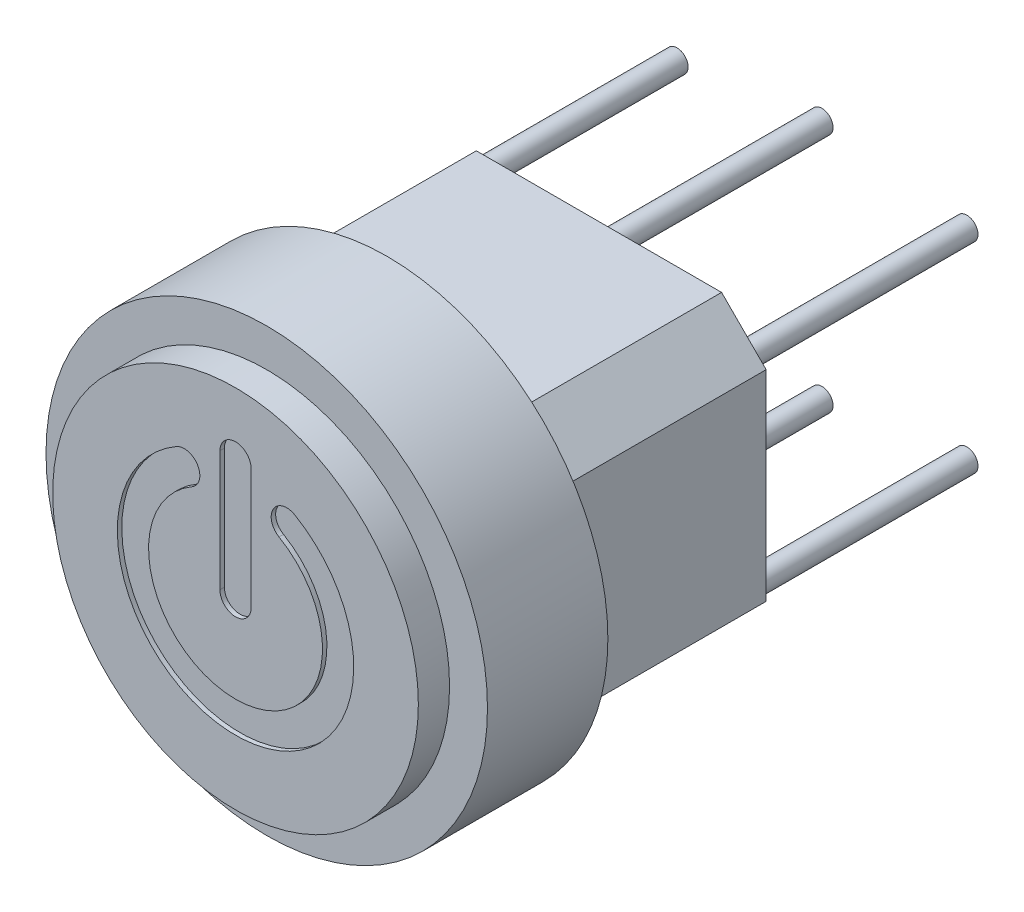
ISO-10303-21;
HEADER;
FILE_DESCRIPTION(('STEP AP214'),'2;1');
FILE_NAME('part.step','',(''),(''),'','','');
FILE_SCHEMA(('AUTOMOTIVE_DESIGN { 1 0 10303 214 1 1 1 1 }'));
ENDSEC;
DATA;
#1=APPLICATION_CONTEXT('core data for automotive mechanical design processes');
#2=APPLICATION_PROTOCOL_DEFINITION('international standard','automotive_design',2000,#1);
#3=PRODUCT_CONTEXT('',#1,'mechanical');
#4=PRODUCT('Part','Part','',(#3));
#5=PRODUCT_RELATED_PRODUCT_CATEGORY('part','',(#4));
#6=PRODUCT_DEFINITION_FORMATION('','',#4);
#7=PRODUCT_DEFINITION_CONTEXT('part definition',#1,'design');
#8=PRODUCT_DEFINITION('design','',#6,#7);
#9=PRODUCT_DEFINITION_SHAPE('','',#8);
#10=(LENGTH_UNIT() NAMED_UNIT(*) SI_UNIT(.MILLI.,.METRE.));
#11=(NAMED_UNIT(*) PLANE_ANGLE_UNIT() SI_UNIT($,.RADIAN.));
#12=(NAMED_UNIT(*) SI_UNIT($,.STERADIAN.) SOLID_ANGLE_UNIT());
#13=UNCERTAINTY_MEASURE_WITH_UNIT(LENGTH_MEASURE(1.E-05),#10,'distance_accuracy_value','');
#14=(GEOMETRIC_REPRESENTATION_CONTEXT(3) GLOBAL_UNCERTAINTY_ASSIGNED_CONTEXT((#13)) GLOBAL_UNIT_ASSIGNED_CONTEXT((#10,
#11,#12)) REPRESENTATION_CONTEXT('',''));
#15=CARTESIAN_POINT('',(0.,0.,0.));
#16=DIRECTION('',(0.,0.,1.));
#17=DIRECTION('',(1.,0.,0.));
#18=AXIS2_PLACEMENT_3D('',#15,#16,#17);
#19=CARTESIAN_POINT('',(0.,0.,0.));
#20=DIRECTION('',(0.,0.,1.));
#21=DIRECTION('',(1.,0.,0.));
#22=AXIS2_PLACEMENT_3D('',#19,#20,#21);
#23=PLANE('',#22);
#24=CARTESIAN_POINT('',(0.,0.,0.));
#25=DIRECTION('',(0.,0.,1.));
#26=DIRECTION('',(1.,0.,0.));
#27=AXIS2_PLACEMENT_3D('',#24,#25,#26);
#28=CIRCLE('',#27,4.95);
#29=CARTESIAN_POINT('',(-4.95,0.,0.));
#30=VERTEX_POINT('',#29);
#31=EDGE_CURVE('E290',#30,#30,#28,.T.);
#32=ORIENTED_EDGE('',*,*,#31,.F.);
#33=EDGE_LOOP('',(#32));
#34=FACE_BOUND('',#33,.T.);
#35=DIRECTION('',(1.,0.,0.));
#36=VECTOR('',#35,1.);
#37=CARTESIAN_POINT('',(3.75,3.25,0.));
#38=LINE('',#37,#36);
#39=CARTESIAN_POINT('',(-2.75,3.25,0.));
#40=VERTEX_POINT('',#39);
#41=CARTESIAN_POINT('',(2.75,3.25,0.));
#42=VERTEX_POINT('',#41);
#43=EDGE_CURVE('E294',#40,#42,#38,.T.);
#44=ORIENTED_EDGE('',*,*,#43,.F.);
#45=DIRECTION('',(0.707106781186546,0.707106781186549,0.));
#46=VECTOR('',#45,1.);
#47=CARTESIAN_POINT('',(-3.,2.99999999999999,0.));
#48=LINE('',#47,#46);
#49=CARTESIAN_POINT('',(-3.75,2.25,0.));
#50=VERTEX_POINT('',#49);
#51=EDGE_CURVE('E334',#40,#50,#48,.F.);
#52=ORIENTED_EDGE('',*,*,#51,.T.);
#53=DIRECTION('',(0.,1.,0.));
#54=VECTOR('',#53,1.);
#55=CARTESIAN_POINT('',(-3.75,3.25,0.));
#56=LINE('',#55,#54);
#57=CARTESIAN_POINT('',(-3.75,-2.25,0.));
#58=VERTEX_POINT('',#57);
#59=EDGE_CURVE('E278',#58,#50,#56,.T.);
#60=ORIENTED_EDGE('',*,*,#59,.F.);
#61=DIRECTION('',(-0.707106781186549,0.707106781186546,0.));
#62=VECTOR('',#61,1.);
#63=CARTESIAN_POINT('',(-3.,-3.,0.));
#64=LINE('',#63,#62);
#65=CARTESIAN_POINT('',(-2.75,-3.25,0.));
#66=VERTEX_POINT('',#65);
#67=EDGE_CURVE('E336',#58,#66,#64,.F.);
#68=ORIENTED_EDGE('',*,*,#67,.T.);
#69=DIRECTION('',(-1.,0.,0.));
#70=VECTOR('',#69,1.);
#71=CARTESIAN_POINT('',(3.75,-3.25,0.));
#72=LINE('',#71,#70);
#73=CARTESIAN_POINT('',(2.75,-3.25,0.));
#74=VERTEX_POINT('',#73);
#75=EDGE_CURVE('E293',#74,#66,#72,.T.);
#76=ORIENTED_EDGE('',*,*,#75,.F.);
#77=DIRECTION('',(-0.707106781186546,-0.707106781186549,0.));
#78=VECTOR('',#77,1.);
#79=CARTESIAN_POINT('',(3.00000000000001,-2.99999999999999,0.));
#80=LINE('',#79,#78);
#81=CARTESIAN_POINT('',(3.75,-2.24999999999999,0.));
#82=VERTEX_POINT('',#81);
#83=EDGE_CURVE('E64',#74,#82,#80,.F.);
#84=ORIENTED_EDGE('',*,*,#83,.T.);
#85=DIRECTION('',(0.,-1.,0.));
#86=VECTOR('',#85,1.);
#87=CARTESIAN_POINT('',(3.75,3.25,0.));
#88=LINE('',#87,#86);
#89=CARTESIAN_POINT('',(3.75,2.25,0.));
#90=VERTEX_POINT('',#89);
#91=EDGE_CURVE('E297',#90,#82,#88,.T.);
#92=ORIENTED_EDGE('',*,*,#91,.F.);
#93=DIRECTION('',(0.707106781186549,-0.707106781186546,0.));
#94=VECTOR('',#93,1.);
#95=CARTESIAN_POINT('',(2.99999999999999,3.00000000000001,0.));
#96=LINE('',#95,#94);
#97=EDGE_CURVE('E12',#90,#42,#96,.F.);
#98=ORIENTED_EDGE('',*,*,#97,.T.);
#99=EDGE_LOOP('',(#44,#52,#60,#68,#76,#84,#92,#98));
#100=FACE_BOUND('',#99,.T.);
#101=ADVANCED_FACE('F56',(#34,#100),#23,.F.);
#102=CARTESIAN_POINT('',(0.,0.,2.7));
#103=DIRECTION('',(0.,0.,-1.));
#104=DIRECTION('',(-1.,0.,0.));
#105=AXIS2_PLACEMENT_3D('',#102,#103,#104);
#106=CYLINDRICAL_SURFACE('',#105,4.95);
#107=CARTESIAN_POINT('',(0.,0.,2.7));
#108=DIRECTION('',(0.,0.,1.));
#109=DIRECTION('',(1.,0.,0.));
#110=AXIS2_PLACEMENT_3D('',#107,#108,#109);
#111=CIRCLE('',#110,4.95);
#112=CARTESIAN_POINT('',(-4.95,0.,2.7));
#113=VERTEX_POINT('',#112);
#114=EDGE_CURVE('E298',#113,#113,#111,.T.);
#115=CARTESIAN_POINT('',(-4.95,0.,2.7));
#116=CARTESIAN_POINT('',(-4.95,0.,2.671875));
#117=CARTESIAN_POINT('',(-4.95,0.,2.64375));
#118=CARTESIAN_POINT('',(-4.95,0.,2.5875));
#119=CARTESIAN_POINT('',(-4.95,0.,2.559375));
#120=CARTESIAN_POINT('',(-4.95,0.,2.503125));
#121=CARTESIAN_POINT('',(-4.95,0.,2.475));
#122=CARTESIAN_POINT('',(-4.95,0.,2.41875));
#123=CARTESIAN_POINT('',(-4.95,0.,2.390625));
#124=CARTESIAN_POINT('',(-4.95,0.,2.334375));
#125=CARTESIAN_POINT('',(-4.95,0.,2.30625));
#126=CARTESIAN_POINT('',(-4.95,0.,2.25));
#127=CARTESIAN_POINT('',(-4.95,0.,2.221875));
#128=CARTESIAN_POINT('',(-4.95,0.,2.165625));
#129=CARTESIAN_POINT('',(-4.95,0.,2.1375));
#130=CARTESIAN_POINT('',(-4.95,0.,2.08125));
#131=CARTESIAN_POINT('',(-4.95,0.,2.053125));
#132=CARTESIAN_POINT('',(-4.95,0.,1.996875));
#133=CARTESIAN_POINT('',(-4.95,0.,1.96875));
#134=CARTESIAN_POINT('',(-4.95,0.,1.9125));
#135=CARTESIAN_POINT('',(-4.95,0.,1.884375));
#136=CARTESIAN_POINT('',(-4.95,0.,1.828125));
#137=CARTESIAN_POINT('',(-4.95,0.,1.8));
#138=CARTESIAN_POINT('',(-4.95,0.,1.74375));
#139=CARTESIAN_POINT('',(-4.95,0.,1.715625));
#140=CARTESIAN_POINT('',(-4.95,0.,1.659375));
#141=CARTESIAN_POINT('',(-4.95,0.,1.63125));
#142=CARTESIAN_POINT('',(-4.95,0.,1.575));
#143=CARTESIAN_POINT('',(-4.95,0.,1.546875));
#144=CARTESIAN_POINT('',(-4.95,0.,1.490625));
#145=CARTESIAN_POINT('',(-4.95,0.,1.4625));
#146=CARTESIAN_POINT('',(-4.95,0.,1.40625));
#147=CARTESIAN_POINT('',(-4.95,0.,1.378125));
#148=CARTESIAN_POINT('',(-4.95,0.,1.321875));
#149=CARTESIAN_POINT('',(-4.95,0.,1.29375));
#150=CARTESIAN_POINT('',(-4.95,0.,1.2375));
#151=CARTESIAN_POINT('',(-4.95,0.,1.209375));
#152=CARTESIAN_POINT('',(-4.95,0.,1.153125));
#153=CARTESIAN_POINT('',(-4.95,0.,1.125));
#154=CARTESIAN_POINT('',(-4.95,0.,1.06875));
#155=CARTESIAN_POINT('',(-4.95,0.,1.040625));
#156=CARTESIAN_POINT('',(-4.95,0.,0.984375));
#157=CARTESIAN_POINT('',(-4.95,0.,0.95625));
#158=CARTESIAN_POINT('',(-4.95,0.,0.9));
#159=CARTESIAN_POINT('',(-4.95,0.,0.871875));
#160=CARTESIAN_POINT('',(-4.95,0.,0.815625));
#161=CARTESIAN_POINT('',(-4.95,0.,0.7875));
#162=CARTESIAN_POINT('',(-4.95,0.,0.73125));
#163=CARTESIAN_POINT('',(-4.95,0.,0.703125));
#164=CARTESIAN_POINT('',(-4.95,0.,0.646875));
#165=CARTESIAN_POINT('',(-4.95,0.,0.61875));
#166=CARTESIAN_POINT('',(-4.95,0.,0.5625));
#167=CARTESIAN_POINT('',(-4.95,0.,0.534375));
#168=CARTESIAN_POINT('',(-4.95,0.,0.478125));
#169=CARTESIAN_POINT('',(-4.95,0.,0.45));
#170=CARTESIAN_POINT('',(-4.95,0.,0.39375));
#171=CARTESIAN_POINT('',(-4.95,0.,0.365625));
#172=CARTESIAN_POINT('',(-4.95,0.,0.309375));
#173=CARTESIAN_POINT('',(-4.95,0.,0.28125));
#174=CARTESIAN_POINT('',(-4.95,0.,0.225));
#175=CARTESIAN_POINT('',(-4.95,0.,0.196875));
#176=CARTESIAN_POINT('',(-4.95,0.,0.140625));
#177=CARTESIAN_POINT('',(-4.95,0.,0.112499999999999));
#178=CARTESIAN_POINT('',(-4.95,0.,0.0562499999999994));
#179=CARTESIAN_POINT('',(-4.95,0.,0.0281249999999995));
#180=CARTESIAN_POINT('',(-4.95,0.,0.));
#181=B_SPLINE_CURVE_WITH_KNOTS('',3,(#115,#116,#117,#118,#119,#120,#121,#122,#123,#124,#125,
#126,#127,#128,#129,#130,#131,#132,#133,#134,#135,#136,#137,#138,#139,#140,#141,#142,#143,#144,
#145,#146,#147,#148,#149,#150,#151,#152,#153,#154,#155,#156,#157,#158,#159,#160,#161,#162,#163,
#164,#165,#166,#167,#168,#169,#170,#171,#172,#173,#174,#175,#176,#177,#178,#179,#180),
.UNSPECIFIED.,.F.,.F.,(4,2,2,2,2,2,2,2,2,2,2,2,2,2,2,2,2,2,2,2,2,2,2,2,2,2,2,2,2,2,2,2,4),(0.,
0.0843749999999998,0.16875,0.253125,0.3375,0.421875,0.50625,0.590625,0.675,0.759375,0.84375,
0.928125,1.0125,1.096875,1.18125,1.265625,1.35,1.434375,1.51875,1.603125,1.6875,1.771875,
1.85625,1.940625,2.025,2.109375,2.19375,2.278125,2.3625,2.446875,2.53125,2.615625,2.7),.UNSPECIFIED.);
#182=EDGE_CURVE('BSEAM385',#113,#30,#181,.T.);
#183=ORIENTED_EDGE('',*,*,#114,.F.);
#184=ORIENTED_EDGE('',*,*,#31,.T.);
#185=ORIENTED_EDGE('',*,*,#182,.T.);
#186=ORIENTED_EDGE('',*,*,#182,.F.);
#187=EDGE_LOOP('',(#183,#185,#184,#186));
#188=FACE_BOUND('',#187,.T.);
#189=ADVANCED_FACE('F385',(#188),#106,.T.);
#190=CARTESIAN_POINT('',(0.,0.,2.7));
#191=DIRECTION('',(0.,0.,1.));
#192=DIRECTION('',(1.,0.,0.));
#193=AXIS2_PLACEMENT_3D('',#190,#191,#192);
#194=PLANE('',#193);
#195=CARTESIAN_POINT('',(0.,0.,2.7));
#196=DIRECTION('',(0.,0.,1.));
#197=DIRECTION('',(1.,0.,0.));
#198=AXIS2_PLACEMENT_3D('',#195,#196,#197);
#199=CIRCLE('',#198,4.1);
#200=CARTESIAN_POINT('',(4.1,0.,2.7));
#201=VERTEX_POINT('',#200);
#202=EDGE_CURVE('E274',#201,#201,#199,.T.);
#203=ORIENTED_EDGE('',*,*,#202,.F.);
#204=EDGE_LOOP('',(#203));
#205=FACE_BOUND('',#204,.T.);
#206=ORIENTED_EDGE('',*,*,#114,.T.);
#207=EDGE_LOOP('',(#206));
#208=FACE_BOUND('',#207,.T.);
#209=ADVANCED_FACE('F391',(#205,#208),#194,.T.);
#210=CARTESIAN_POINT('',(-3.75,3.25,-4.75));
#211=DIRECTION('',(1.,0.,0.));
#212=DIRECTION('',(0.,1.,0.));
#213=AXIS2_PLACEMENT_3D('',#210,#211,#212);
#214=PLANE('',#213);
#215=ORIENTED_EDGE('',*,*,#59,.T.);
#216=DIRECTION('',(0.,0.,-1.));
#217=VECTOR('',#216,1.);
#218=CARTESIAN_POINT('',(-3.75,2.25,-4.75));
#219=LINE('',#218,#217);
#220=CARTESIAN_POINT('',(-3.75,2.25,-4.75));
#221=VERTEX_POINT('',#220);
#222=EDGE_CURVE('E314',#50,#221,#219,.T.);
#223=ORIENTED_EDGE('',*,*,#222,.T.);
#224=DIRECTION('',(0.,1.,0.));
#225=VECTOR('',#224,1.);
#226=CARTESIAN_POINT('',(-3.75,3.25,-4.75));
#227=LINE('',#226,#225);
#228=CARTESIAN_POINT('',(-3.75,-2.25,-4.75));
#229=VERTEX_POINT('',#228);
#230=EDGE_CURVE('E273',#229,#221,#227,.T.);
#231=ORIENTED_EDGE('',*,*,#230,.F.);
#232=DIRECTION('',(0.,0.,1.));
#233=VECTOR('',#232,1.);
#234=CARTESIAN_POINT('',(-3.75,-2.25,-4.75));
#235=LINE('',#234,#233);
#236=EDGE_CURVE('E311',#229,#58,#235,.T.);
#237=ORIENTED_EDGE('',*,*,#236,.T.);
#238=EDGE_LOOP('',(#215,#223,#231,#237));
#239=FACE_BOUND('',#238,.T.);
#240=ADVANCED_FACE('F363',(#239),#214,.F.);
#241=CARTESIAN_POINT('',(3.75,3.25,-4.75));
#242=DIRECTION('',(0.,-1.,0.));
#243=DIRECTION('',(0.,0.,-1.));
#244=AXIS2_PLACEMENT_3D('',#241,#242,#243);
#245=PLANE('',#244);
#246=DIRECTION('',(1.,0.,0.));
#247=VECTOR('',#246,1.);
#248=CARTESIAN_POINT('',(3.75,3.25,-4.75));
#249=LINE('',#248,#247);
#250=CARTESIAN_POINT('',(-2.75,3.25,-4.75));
#251=VERTEX_POINT('',#250);
#252=CARTESIAN_POINT('',(2.75,3.25,-4.75));
#253=VERTEX_POINT('',#252);
#254=EDGE_CURVE('E281',#251,#253,#249,.T.);
#255=ORIENTED_EDGE('',*,*,#254,.F.);
#256=DIRECTION('',(0.,0.,1.));
#257=VECTOR('',#256,1.);
#258=CARTESIAN_POINT('',(-2.75,3.25,-4.75));
#259=LINE('',#258,#257);
#260=EDGE_CURVE('E308',#251,#40,#259,.T.);
#261=ORIENTED_EDGE('',*,*,#260,.T.);
#262=ORIENTED_EDGE('',*,*,#43,.T.);
#263=DIRECTION('',(0.,0.,-1.));
#264=VECTOR('',#263,1.);
#265=CARTESIAN_POINT('',(2.75,3.25,-4.75));
#266=LINE('',#265,#264);
#267=EDGE_CURVE('E277',#42,#253,#266,.T.);
#268=ORIENTED_EDGE('',*,*,#267,.T.);
#269=EDGE_LOOP('',(#255,#261,#262,#268));
#270=FACE_BOUND('',#269,.T.);
#271=ADVANCED_FACE('F372',(#270),#245,.F.);
#272=CARTESIAN_POINT('',(3.75,3.25,-4.75));
#273=DIRECTION('',(-1.,0.,0.));
#274=DIRECTION('',(0.,-1.,0.));
#275=AXIS2_PLACEMENT_3D('',#272,#273,#274);
#276=PLANE('',#275);
#277=ORIENTED_EDGE('',*,*,#91,.T.);
#278=DIRECTION('',(0.,0.,-1.));
#279=VECTOR('',#278,1.);
#280=CARTESIAN_POINT('',(3.75,-2.25,-4.75));
#281=LINE('',#280,#279);
#282=CARTESIAN_POINT('',(3.75,-2.24999999999999,-4.75));
#283=VERTEX_POINT('',#282);
#284=EDGE_CURVE('E332',#82,#283,#281,.T.);
#285=ORIENTED_EDGE('',*,*,#284,.T.);
#286=DIRECTION('',(0.,-1.,0.));
#287=VECTOR('',#286,1.);
#288=CARTESIAN_POINT('',(3.75,3.25,-4.75));
#289=LINE('',#288,#287);
#290=CARTESIAN_POINT('',(3.75,2.25,-4.75));
#291=VERTEX_POINT('',#290);
#292=EDGE_CURVE('E284',#291,#283,#289,.T.);
#293=ORIENTED_EDGE('',*,*,#292,.F.);
#294=DIRECTION('',(0.,0.,1.));
#295=VECTOR('',#294,1.);
#296=CARTESIAN_POINT('',(3.75,2.25,-4.75));
#297=LINE('',#296,#295);
#298=EDGE_CURVE('E329',#291,#90,#297,.T.);
#299=ORIENTED_EDGE('',*,*,#298,.T.);
#300=EDGE_LOOP('',(#277,#285,#293,#299));
#301=FACE_BOUND('',#300,.T.);
#302=ADVANCED_FACE('F345',(#301),#276,.F.);
#303=CARTESIAN_POINT('',(3.75,-3.25,-4.75));
#304=DIRECTION('',(0.,1.,0.));
#305=DIRECTION('',(0.,0.,1.));
#306=AXIS2_PLACEMENT_3D('',#303,#304,#305);
#307=PLANE('',#306);
#308=ORIENTED_EDGE('',*,*,#75,.T.);
#309=DIRECTION('',(0.,0.,-1.));
#310=VECTOR('',#309,1.);
#311=CARTESIAN_POINT('',(-2.75,-3.25,-4.75));
#312=LINE('',#311,#310);
#313=CARTESIAN_POINT('',(-2.75,-3.25,-4.75));
#314=VERTEX_POINT('',#313);
#315=EDGE_CURVE('E327',#66,#314,#312,.T.);
#316=ORIENTED_EDGE('',*,*,#315,.T.);
#317=DIRECTION('',(-1.,0.,0.));
#318=VECTOR('',#317,1.);
#319=CARTESIAN_POINT('',(3.75,-3.25,-4.75));
#320=LINE('',#319,#318);
#321=CARTESIAN_POINT('',(2.75,-3.25,-4.75));
#322=VERTEX_POINT('',#321);
#323=EDGE_CURVE('E287',#322,#314,#320,.T.);
#324=ORIENTED_EDGE('',*,*,#323,.F.);
#325=DIRECTION('',(0.,0.,1.));
#326=VECTOR('',#325,1.);
#327=CARTESIAN_POINT('',(2.75,-3.25,-4.75));
#328=LINE('',#327,#326);
#329=EDGE_CURVE('E324',#322,#74,#328,.T.);
#330=ORIENTED_EDGE('',*,*,#329,.T.);
#331=EDGE_LOOP('',(#308,#316,#324,#330));
#332=FACE_BOUND('',#331,.T.);
#333=ADVANCED_FACE('F355',(#332),#307,.F.);
#334=CARTESIAN_POINT('',(0.,0.,-4.75));
#335=DIRECTION('',(0.,0.,-1.));
#336=DIRECTION('',(-1.,0.,0.));
#337=AXIS2_PLACEMENT_3D('',#334,#335,#336);
#338=PLANE('',#337);
#339=CARTESIAN_POINT('',(3.25,-2.25,-4.75));
#340=DIRECTION('',(0.,0.,-1.));
#341=DIRECTION('',(1.,0.,0.));
#342=AXIS2_PLACEMENT_3D('',#339,#340,#341);
#343=CIRCLE('',#342,0.25);
#344=CARTESIAN_POINT('',(3.5,-2.25,-4.75));
#345=VERTEX_POINT('',#344);
#346=EDGE_CURVE('E229',#345,#345,#343,.T.);
#347=ORIENTED_EDGE('',*,*,#346,.F.);
#348=EDGE_LOOP('',(#347));
#349=FACE_BOUND('',#348,.T.);
#350=CARTESIAN_POINT('',(0.,-2.7,-4.75));
#351=DIRECTION('',(0.,0.,-1.));
#352=DIRECTION('',(1.,0.,0.));
#353=AXIS2_PLACEMENT_3D('',#350,#351,#352);
#354=CIRCLE('',#353,0.25);
#355=CARTESIAN_POINT('',(0.250000000000006,-2.7,-4.75));
#356=VERTEX_POINT('',#355);
#357=EDGE_CURVE('E238',#356,#356,#354,.T.);
#358=ORIENTED_EDGE('',*,*,#357,.F.);
#359=EDGE_LOOP('',(#358));
#360=FACE_BOUND('',#359,.T.);
#361=CARTESIAN_POINT('',(-3.24999999999999,-2.25000000000001,-4.75));
#362=DIRECTION('',(0.,0.,-1.));
#363=DIRECTION('',(1.,0.,0.));
#364=AXIS2_PLACEMENT_3D('',#361,#362,#363);
#365=CIRCLE('',#364,0.25);
#366=CARTESIAN_POINT('',(-2.99999999999999,-2.25000000000001,-4.75));
#367=VERTEX_POINT('',#366);
#368=EDGE_CURVE('E244',#367,#367,#365,.T.);
#369=ORIENTED_EDGE('',*,*,#368,.F.);
#370=EDGE_LOOP('',(#369));
#371=FACE_BOUND('',#370,.T.);
#372=CARTESIAN_POINT('',(-3.25,2.25,-4.75));
#373=DIRECTION('',(0.,0.,-1.));
#374=DIRECTION('',(-1.,0.,0.));
#375=AXIS2_PLACEMENT_3D('',#372,#373,#374);
#376=CIRCLE('',#375,0.25);
#377=CARTESIAN_POINT('',(-3.5,2.25,-4.75));
#378=VERTEX_POINT('',#377);
#379=EDGE_CURVE('E250',#378,#378,#376,.T.);
#380=ORIENTED_EDGE('',*,*,#379,.F.);
#381=EDGE_LOOP('',(#380));
#382=FACE_BOUND('',#381,.T.);
#383=CARTESIAN_POINT('',(0.,2.7,-4.75));
#384=DIRECTION('',(0.,0.,-1.));
#385=DIRECTION('',(-1.,0.,0.));
#386=AXIS2_PLACEMENT_3D('',#383,#384,#385);
#387=CIRCLE('',#386,0.25);
#388=CARTESIAN_POINT('',(-0.25,2.7,-4.75));
#389=VERTEX_POINT('',#388);
#390=EDGE_CURVE('E256',#389,#389,#387,.T.);
#391=ORIENTED_EDGE('',*,*,#390,.F.);
#392=EDGE_LOOP('',(#391));
#393=FACE_BOUND('',#392,.T.);
#394=CARTESIAN_POINT('',(3.25,2.25,-4.75));
#395=DIRECTION('',(0.,0.,-1.));
#396=DIRECTION('',(-1.,0.,0.));
#397=AXIS2_PLACEMENT_3D('',#394,#395,#396);
#398=CIRCLE('',#397,0.25);
#399=CARTESIAN_POINT('',(3.,2.25,-4.75));
#400=VERTEX_POINT('',#399);
#401=EDGE_CURVE('E262',#400,#400,#398,.T.);
#402=ORIENTED_EDGE('',*,*,#401,.F.);
#403=EDGE_LOOP('',(#402));
#404=FACE_BOUND('',#403,.T.);
#405=ORIENTED_EDGE('',*,*,#230,.T.);
#406=DIRECTION('',(-0.707106781186546,-0.707106781186549,0.));
#407=VECTOR('',#406,1.);
#408=CARTESIAN_POINT('',(-3.,2.99999999999999,-4.75));
#409=LINE('',#408,#407);
#410=EDGE_CURVE('E322',#221,#251,#409,.F.);
#411=ORIENTED_EDGE('',*,*,#410,.T.);
#412=ORIENTED_EDGE('',*,*,#254,.T.);
#413=DIRECTION('',(-0.707106781186549,0.707106781186546,0.));
#414=VECTOR('',#413,1.);
#415=CARTESIAN_POINT('',(2.99999999999999,3.00000000000001,-4.75));
#416=LINE('',#415,#414);
#417=EDGE_CURVE('E316',#253,#291,#416,.F.);
#418=ORIENTED_EDGE('',*,*,#417,.T.);
#419=ORIENTED_EDGE('',*,*,#292,.T.);
#420=DIRECTION('',(0.707106781186546,0.707106781186549,0.));
#421=VECTOR('',#420,1.);
#422=CARTESIAN_POINT('',(3.00000000000001,-2.99999999999999,-4.75));
#423=LINE('',#422,#421);
#424=EDGE_CURVE('E318',#283,#322,#423,.F.);
#425=ORIENTED_EDGE('',*,*,#424,.T.);
#426=ORIENTED_EDGE('',*,*,#323,.T.);
#427=DIRECTION('',(0.707106781186549,-0.707106781186546,0.));
#428=VECTOR('',#427,1.);
#429=CARTESIAN_POINT('',(-3.,-3.,-4.75));
#430=LINE('',#429,#428);
#431=EDGE_CURVE('E320',#314,#229,#430,.F.);
#432=ORIENTED_EDGE('',*,*,#431,.T.);
#433=EDGE_LOOP('',(#405,#411,#412,#418,#419,#425,#426,#432));
#434=FACE_BOUND('',#433,.T.);
#435=ADVANCED_FACE('F352',(#349,#360,#371,#382,#393,#404,#434),#338,.T.);
#436=CARTESIAN_POINT('',(0.,0.,3.4));
#437=DIRECTION('',(0.,0.,-1.));
#438=DIRECTION('',(-1.,0.,0.));
#439=AXIS2_PLACEMENT_3D('',#436,#437,#438);
#440=CYLINDRICAL_SURFACE('',#439,4.1);
#441=CARTESIAN_POINT('',(0.,0.,3.4));
#442=DIRECTION('',(0.,0.,1.));
#443=DIRECTION('',(1.,0.,0.));
#444=AXIS2_PLACEMENT_3D('',#441,#442,#443);
#445=CIRCLE('',#444,4.1);
#446=CARTESIAN_POINT('',(4.1,0.,3.4));
#447=VERTEX_POINT('',#446);
#448=EDGE_CURVE('E268',#447,#447,#445,.T.);
#449=ORIENTED_EDGE('',*,*,#448,.F.);
#450=EDGE_LOOP('',(#449));
#451=FACE_BOUND('',#450,.T.);
#452=ORIENTED_EDGE('',*,*,#202,.T.);
#453=EDGE_LOOP('',(#452));
#454=FACE_BOUND('',#453,.T.);
#455=ADVANCED_FACE('F425',(#451,#454),#440,.T.);
#456=CARTESIAN_POINT('',(0.,0.,3.4));
#457=DIRECTION('',(0.,0.,1.));
#458=DIRECTION('',(1.,0.,0.));
#459=AXIS2_PLACEMENT_3D('',#456,#457,#458);
#460=PLANE('',#459);
#461=CARTESIAN_POINT('',(0.,0.,3.4));
#462=DIRECTION('',(0.,0.,1.));
#463=DIRECTION('',(1.,0.,0.));
#464=AXIS2_PLACEMENT_3D('',#461,#462,#463);
#465=CIRCLE('',#464,2.65);
#466=CARTESIAN_POINT('',(-1.325,2.29496732002876,3.4));
#467=VERTEX_POINT('',#466);
#468=CARTESIAN_POINT('',(1.32499999999999,2.29496732002877,3.4));
#469=VERTEX_POINT('',#468);
#470=EDGE_CURVE('E71',#467,#469,#465,.T.);
#471=ORIENTED_EDGE('',*,*,#470,.F.);
#472=CARTESIAN_POINT('',(-1.15,1.99185842870421,3.4));
#473=DIRECTION('',(0.,0.,1.));
#474=DIRECTION('',(1.,0.,0.));
#475=AXIS2_PLACEMENT_3D('',#472,#473,#474);
#476=CIRCLE('',#475,0.35);
#477=CARTESIAN_POINT('',(-0.975000000000003,1.68874953737965,3.4));
#478=VERTEX_POINT('',#477);
#479=EDGE_CURVE('E187',#467,#478,#476,.F.);
#480=ORIENTED_EDGE('',*,*,#479,.T.);
#481=CARTESIAN_POINT('',(0.,0.,3.4));
#482=DIRECTION('',(0.,0.,1.));
#483=DIRECTION('',(1.,0.,0.));
#484=AXIS2_PLACEMENT_3D('',#481,#482,#483);
#485=CIRCLE('',#484,1.95);
#486=CARTESIAN_POINT('',(0.97499999999999,1.68874953737966,3.4));
#487=VERTEX_POINT('',#486);
#488=EDGE_CURVE('E190',#478,#487,#485,.T.);
#489=ORIENTED_EDGE('',*,*,#488,.T.);
#490=CARTESIAN_POINT('',(1.14999999999999,1.99185842870422,3.4));
#491=DIRECTION('',(0.,0.,1.));
#492=DIRECTION('',(1.,0.,0.));
#493=AXIS2_PLACEMENT_3D('',#490,#491,#492);
#494=CIRCLE('',#493,0.35);
#495=EDGE_CURVE('E196',#469,#487,#494,.T.);
#496=ORIENTED_EDGE('',*,*,#495,.F.);
#497=EDGE_LOOP('',(#471,#480,#489,#496));
#498=FACE_BOUND('',#497,.T.);
#499=DIRECTION('',(0.,-1.,0.));
#500=VECTOR('',#499,1.);
#501=CARTESIAN_POINT('',(-0.35,0.,3.4));
#502=LINE('',#501,#500);
#503=CARTESIAN_POINT('',(-0.35,2.7,3.4));
#504=VERTEX_POINT('',#503);
#505=CARTESIAN_POINT('',(-0.35,0.,3.4));
#506=VERTEX_POINT('',#505);
#507=EDGE_CURVE('E79',#504,#506,#502,.T.);
#508=ORIENTED_EDGE('',*,*,#507,.F.);
#509=CARTESIAN_POINT('',(0.,2.7,3.4));
#510=DIRECTION('',(0.,0.,1.));
#511=DIRECTION('',(1.,0.,0.));
#512=AXIS2_PLACEMENT_3D('',#509,#510,#511);
#513=CIRCLE('',#512,0.35);
#514=CARTESIAN_POINT('',(0.35,2.7,3.4));
#515=VERTEX_POINT('',#514);
#516=EDGE_CURVE('E209',#515,#504,#513,.T.);
#517=ORIENTED_EDGE('',*,*,#516,.F.);
#518=DIRECTION('',(0.,-1.,0.));
#519=VECTOR('',#518,1.);
#520=CARTESIAN_POINT('',(0.35,0.,3.4));
#521=LINE('',#520,#519);
#522=CARTESIAN_POINT('',(0.35,0.,3.4));
#523=VERTEX_POINT('',#522);
#524=EDGE_CURVE('E222',#515,#523,#521,.T.);
#525=ORIENTED_EDGE('',*,*,#524,.T.);
#526=CARTESIAN_POINT('',(0.,0.,3.4));
#527=DIRECTION('',(0.,0.,1.));
#528=DIRECTION('',(1.,0.,0.));
#529=AXIS2_PLACEMENT_3D('',#526,#527,#528);
#530=CIRCLE('',#529,0.35);
#531=EDGE_CURVE('E219',#506,#523,#530,.T.);
#532=ORIENTED_EDGE('',*,*,#531,.F.);
#533=EDGE_LOOP('',(#508,#517,#525,#532));
#534=FACE_BOUND('',#533,.T.);
#535=ORIENTED_EDGE('',*,*,#448,.T.);
#536=EDGE_LOOP('',(#535));
#537=FACE_BOUND('',#536,.T.);
#538=ADVANCED_FACE('F400',(#498,#534,#537),#460,.T.);
#539=CARTESIAN_POINT('',(-2.75,3.25,-4.75));
#540=DIRECTION('',(0.707106781186549,-0.707106781186546,0.));
#541=DIRECTION('',(0.,0.,1.));
#542=AXIS2_PLACEMENT_3D('',#539,#540,#541);
#543=PLANE('',#542);
#544=ORIENTED_EDGE('',*,*,#410,.F.);
#545=ORIENTED_EDGE('',*,*,#222,.F.);
#546=ORIENTED_EDGE('',*,*,#51,.F.);
#547=ORIENTED_EDGE('',*,*,#260,.F.);
#548=EDGE_LOOP('',(#544,#545,#546,#547));
#549=FACE_BOUND('',#548,.T.);
#550=ADVANCED_FACE('F367',(#549),#543,.F.);
#551=CARTESIAN_POINT('',(-3.75,-2.25,-4.75));
#552=DIRECTION('',(0.707106781186546,0.707106781186549,0.));
#553=DIRECTION('',(0.,0.,1.));
#554=AXIS2_PLACEMENT_3D('',#551,#552,#553);
#555=PLANE('',#554);
#556=ORIENTED_EDGE('',*,*,#431,.F.);
#557=ORIENTED_EDGE('',*,*,#315,.F.);
#558=ORIENTED_EDGE('',*,*,#67,.F.);
#559=ORIENTED_EDGE('',*,*,#236,.F.);
#560=EDGE_LOOP('',(#556,#557,#558,#559));
#561=FACE_BOUND('',#560,.T.);
#562=ADVANCED_FACE('F358',(#561),#555,.F.);
#563=CARTESIAN_POINT('',(2.75,-3.25,-4.75));
#564=DIRECTION('',(-0.707106781186549,0.707106781186546,0.));
#565=DIRECTION('',(0.,0.,1.));
#566=AXIS2_PLACEMENT_3D('',#563,#564,#565);
#567=PLANE('',#566);
#568=ORIENTED_EDGE('',*,*,#424,.F.);
#569=ORIENTED_EDGE('',*,*,#284,.F.);
#570=ORIENTED_EDGE('',*,*,#83,.F.);
#571=ORIENTED_EDGE('',*,*,#329,.F.);
#572=EDGE_LOOP('',(#568,#569,#570,#571));
#573=FACE_BOUND('',#572,.T.);
#574=ADVANCED_FACE('F349',(#573),#567,.F.);
#575=CARTESIAN_POINT('',(3.75,2.25,-4.75));
#576=DIRECTION('',(-0.707106781186546,-0.707106781186549,0.));
#577=DIRECTION('',(0.,0.,1.));
#578=AXIS2_PLACEMENT_3D('',#575,#576,#577);
#579=PLANE('',#578);
#580=ORIENTED_EDGE('',*,*,#417,.F.);
#581=ORIENTED_EDGE('',*,*,#267,.F.);
#582=ORIENTED_EDGE('',*,*,#97,.F.);
#583=ORIENTED_EDGE('',*,*,#298,.F.);
#584=EDGE_LOOP('',(#580,#581,#582,#583));
#585=FACE_BOUND('',#584,.T.);
#586=ADVANCED_FACE('F58',(#585),#579,.F.);
#587=CARTESIAN_POINT('',(3.25,2.25,-9.75));
#588=DIRECTION('',(0.,0.,1.));
#589=DIRECTION('',(1.,0.,0.));
#590=AXIS2_PLACEMENT_3D('',#587,#588,#589);
#591=CYLINDRICAL_SURFACE('',#590,0.25);
#592=CARTESIAN_POINT('',(3.25,2.25,-9.75));
#593=DIRECTION('',(0.,0.,-1.));
#594=DIRECTION('',(-1.,0.,0.));
#595=AXIS2_PLACEMENT_3D('',#592,#593,#594);
#596=CIRCLE('',#595,0.25);
#597=CARTESIAN_POINT('',(3.,2.25,-9.75));
#598=VERTEX_POINT('',#597);
#599=EDGE_CURVE('E265',#598,#598,#596,.T.);
#600=ORIENTED_EDGE('',*,*,#599,.F.);
#601=EDGE_LOOP('',(#600));
#602=FACE_BOUND('',#601,.T.);
#603=ORIENTED_EDGE('',*,*,#401,.T.);
#604=EDGE_LOOP('',(#603));
#605=FACE_BOUND('',#604,.T.);
#606=ADVANCED_FACE('F376',(#602,#605),#591,.T.);
#607=CARTESIAN_POINT('',(3.25,2.25,-9.75));
#608=DIRECTION('',(0.,0.,-1.));
#609=DIRECTION('',(-1.,0.,0.));
#610=AXIS2_PLACEMENT_3D('',#607,#608,#609);
#611=PLANE('',#610);
#612=ORIENTED_EDGE('',*,*,#599,.T.);
#613=EDGE_LOOP('',(#612));
#614=FACE_BOUND('',#613,.T.);
#615=ADVANCED_FACE('F381',(#614),#611,.T.);
#616=CARTESIAN_POINT('',(0.,2.7,-9.75));
#617=DIRECTION('',(0.,0.,1.));
#618=DIRECTION('',(1.,0.,0.));
#619=AXIS2_PLACEMENT_3D('',#616,#617,#618);
#620=CYLINDRICAL_SURFACE('',#619,0.25);
#621=CARTESIAN_POINT('',(0.,2.7,-9.75));
#622=DIRECTION('',(0.,0.,-1.));
#623=DIRECTION('',(-1.,0.,0.));
#624=AXIS2_PLACEMENT_3D('',#621,#622,#623);
#625=CIRCLE('',#624,0.25);
#626=CARTESIAN_POINT('',(-0.25,2.7,-9.75));
#627=VERTEX_POINT('',#626);
#628=EDGE_CURVE('E259',#627,#627,#625,.T.);
#629=ORIENTED_EDGE('',*,*,#628,.F.);
#630=EDGE_LOOP('',(#629));
#631=FACE_BOUND('',#630,.T.);
#632=ORIENTED_EDGE('',*,*,#390,.T.);
#633=EDGE_LOOP('',(#632));
#634=FACE_BOUND('',#633,.T.);
#635=ADVANCED_FACE('F444',(#631,#634),#620,.T.);
#636=CARTESIAN_POINT('',(0.,2.7,-9.75));
#637=DIRECTION('',(0.,0.,-1.));
#638=DIRECTION('',(-1.,0.,0.));
#639=AXIS2_PLACEMENT_3D('',#636,#637,#638);
#640=PLANE('',#639);
#641=ORIENTED_EDGE('',*,*,#628,.T.);
#642=EDGE_LOOP('',(#641));
#643=FACE_BOUND('',#642,.T.);
#644=ADVANCED_FACE('F454',(#643),#640,.T.);
#645=CARTESIAN_POINT('',(-3.25,2.25,-9.75));
#646=DIRECTION('',(0.,0.,1.));
#647=DIRECTION('',(1.,0.,0.));
#648=AXIS2_PLACEMENT_3D('',#645,#646,#647);
#649=CYLINDRICAL_SURFACE('',#648,0.25);
#650=CARTESIAN_POINT('',(-3.25,2.25,-9.75));
#651=DIRECTION('',(0.,0.,-1.));
#652=DIRECTION('',(-1.,0.,0.));
#653=AXIS2_PLACEMENT_3D('',#650,#651,#652);
#654=CIRCLE('',#653,0.25);
#655=CARTESIAN_POINT('',(-3.5,2.25,-9.75));
#656=VERTEX_POINT('',#655);
#657=EDGE_CURVE('E253',#656,#656,#654,.T.);
#658=ORIENTED_EDGE('',*,*,#657,.F.);
#659=EDGE_LOOP('',(#658));
#660=FACE_BOUND('',#659,.T.);
#661=ORIENTED_EDGE('',*,*,#379,.T.);
#662=EDGE_LOOP('',(#661));
#663=FACE_BOUND('',#662,.T.);
#664=ADVANCED_FACE('F464',(#660,#663),#649,.T.);
#665=CARTESIAN_POINT('',(-3.25,2.25,-9.75));
#666=DIRECTION('',(0.,0.,-1.));
#667=DIRECTION('',(-1.,0.,0.));
#668=AXIS2_PLACEMENT_3D('',#665,#666,#667);
#669=PLANE('',#668);
#670=ORIENTED_EDGE('',*,*,#657,.T.);
#671=EDGE_LOOP('',(#670));
#672=FACE_BOUND('',#671,.T.);
#673=ADVANCED_FACE('F474',(#672),#669,.T.);
#674=CARTESIAN_POINT('',(-3.24999999999999,-2.25000000000001,-9.75));
#675=DIRECTION('',(0.,0.,1.));
#676=DIRECTION('',(1.,0.,0.));
#677=AXIS2_PLACEMENT_3D('',#674,#675,#676);
#678=CYLINDRICAL_SURFACE('',#677,0.25);
#679=CARTESIAN_POINT('',(-3.24999999999999,-2.25000000000001,-9.75));
#680=DIRECTION('',(0.,0.,-1.));
#681=DIRECTION('',(1.,0.,0.));
#682=AXIS2_PLACEMENT_3D('',#679,#680,#681);
#683=CIRCLE('',#682,0.25);
#684=CARTESIAN_POINT('',(-2.99999999999999,-2.25000000000001,-9.75));
#685=VERTEX_POINT('',#684);
#686=EDGE_CURVE('E247',#685,#685,#683,.T.);
#687=ORIENTED_EDGE('',*,*,#686,.F.);
#688=EDGE_LOOP('',(#687));
#689=FACE_BOUND('',#688,.T.);
#690=ORIENTED_EDGE('',*,*,#368,.T.);
#691=EDGE_LOOP('',(#690));
#692=FACE_BOUND('',#691,.T.);
#693=ADVANCED_FACE('F484',(#689,#692),#678,.T.);
#694=CARTESIAN_POINT('',(-3.24999999999999,-2.25000000000001,-9.75));
#695=DIRECTION('',(0.,0.,1.));
#696=DIRECTION('',(1.,0.,0.));
#697=AXIS2_PLACEMENT_3D('',#694,#695,#696);
#698=PLANE('',#697);
#699=ORIENTED_EDGE('',*,*,#686,.T.);
#700=EDGE_LOOP('',(#699));
#701=FACE_BOUND('',#700,.T.);
#702=ADVANCED_FACE('F494',(#701),#698,.F.);
#703=CARTESIAN_POINT('',(0.,-2.7,-9.75));
#704=DIRECTION('',(0.,0.,1.));
#705=DIRECTION('',(1.,0.,0.));
#706=AXIS2_PLACEMENT_3D('',#703,#704,#705);
#707=CYLINDRICAL_SURFACE('',#706,0.25);
#708=CARTESIAN_POINT('',(0.,-2.7,-9.75));
#709=DIRECTION('',(0.,0.,-1.));
#710=DIRECTION('',(1.,0.,0.));
#711=AXIS2_PLACEMENT_3D('',#708,#709,#710);
#712=CIRCLE('',#711,0.25);
#713=CARTESIAN_POINT('',(0.250000000000006,-2.7,-9.75));
#714=VERTEX_POINT('',#713);
#715=EDGE_CURVE('E241',#714,#714,#712,.T.);
#716=ORIENTED_EDGE('',*,*,#715,.F.);
#717=EDGE_LOOP('',(#716));
#718=FACE_BOUND('',#717,.T.);
#719=ORIENTED_EDGE('',*,*,#357,.T.);
#720=EDGE_LOOP('',(#719));
#721=FACE_BOUND('',#720,.T.);
#722=ADVANCED_FACE('F504',(#718,#721),#707,.T.);
#723=CARTESIAN_POINT('',(0.,-2.7,-9.75));
#724=DIRECTION('',(0.,0.,1.));
#725=DIRECTION('',(1.,0.,0.));
#726=AXIS2_PLACEMENT_3D('',#723,#724,#725);
#727=PLANE('',#726);
#728=ORIENTED_EDGE('',*,*,#715,.T.);
#729=EDGE_LOOP('',(#728));
#730=FACE_BOUND('',#729,.T.);
#731=ADVANCED_FACE('F514',(#730),#727,.F.);
#732=CARTESIAN_POINT('',(3.25,-2.25,-9.75));
#733=DIRECTION('',(0.,0.,1.));
#734=DIRECTION('',(1.,0.,0.));
#735=AXIS2_PLACEMENT_3D('',#732,#733,#734);
#736=CYLINDRICAL_SURFACE('',#735,0.25);
#737=CARTESIAN_POINT('',(3.25,-2.25,-9.75));
#738=DIRECTION('',(0.,0.,-1.));
#739=DIRECTION('',(1.,0.,0.));
#740=AXIS2_PLACEMENT_3D('',#737,#738,#739);
#741=CIRCLE('',#740,0.25);
#742=CARTESIAN_POINT('',(3.5,-2.25,-9.75));
#743=VERTEX_POINT('',#742);
#744=EDGE_CURVE('E235',#743,#743,#741,.T.);
#745=ORIENTED_EDGE('',*,*,#744,.F.);
#746=EDGE_LOOP('',(#745));
#747=FACE_BOUND('',#746,.T.);
#748=ORIENTED_EDGE('',*,*,#346,.T.);
#749=EDGE_LOOP('',(#748));
#750=FACE_BOUND('',#749,.T.);
#751=ADVANCED_FACE('F524',(#747,#750),#736,.T.);
#752=CARTESIAN_POINT('',(3.25,-2.25,-9.75));
#753=DIRECTION('',(0.,0.,1.));
#754=DIRECTION('',(1.,0.,0.));
#755=AXIS2_PLACEMENT_3D('',#752,#753,#754);
#756=PLANE('',#755);
#757=ORIENTED_EDGE('',*,*,#744,.T.);
#758=EDGE_LOOP('',(#757));
#759=FACE_BOUND('',#758,.T.);
#760=ADVANCED_FACE('F534',(#759),#756,.F.);
#761=CARTESIAN_POINT('',(-0.35,0.,3.3));
#762=DIRECTION('',(-1.,0.,0.));
#763=DIRECTION('',(0.,-1.,0.));
#764=AXIS2_PLACEMENT_3D('',#761,#762,#763);
#765=PLANE('',#764);
#766=ORIENTED_EDGE('',*,*,#507,.T.);
#767=DIRECTION('',(0.,0.,1.));
#768=VECTOR('',#767,1.);
#769=CARTESIAN_POINT('',(-0.35,0.,3.3));
#770=LINE('',#769,#768);
#771=CARTESIAN_POINT('',(-0.35,0.,3.3));
#772=VERTEX_POINT('',#771);
#773=EDGE_CURVE('E217',#772,#506,#770,.T.);
#774=ORIENTED_EDGE('',*,*,#773,.F.);
#775=DIRECTION('',(0.,-1.,0.));
#776=VECTOR('',#775,1.);
#777=CARTESIAN_POINT('',(-0.35,0.,3.3));
#778=LINE('',#777,#776);
#779=CARTESIAN_POINT('',(-0.35,2.7,3.3));
#780=VERTEX_POINT('',#779);
#781=EDGE_CURVE('E205',#780,#772,#778,.T.);
#782=ORIENTED_EDGE('',*,*,#781,.F.);
#783=DIRECTION('',(0.,0.,1.));
#784=VECTOR('',#783,1.);
#785=CARTESIAN_POINT('',(-0.35,2.7,3.3));
#786=LINE('',#785,#784);
#787=EDGE_CURVE('E227',#780,#504,#786,.T.);
#788=ORIENTED_EDGE('',*,*,#787,.T.);
#789=EDGE_LOOP('',(#766,#774,#782,#788));
#790=FACE_BOUND('',#789,.T.);
#791=ADVANCED_FACE('F544',(#790),#765,.F.);
#792=CARTESIAN_POINT('',(0.,2.7,3.3));
#793=DIRECTION('',(0.,0.,1.));
#794=DIRECTION('',(1.,0.,0.));
#795=AXIS2_PLACEMENT_3D('',#792,#793,#794);
#796=CYLINDRICAL_SURFACE('',#795,0.35);
#797=ORIENTED_EDGE('',*,*,#516,.T.);
#798=ORIENTED_EDGE('',*,*,#787,.F.);
#799=CARTESIAN_POINT('',(0.,2.7,3.3));
#800=DIRECTION('',(0.,0.,1.));
#801=DIRECTION('',(1.,0.,0.));
#802=AXIS2_PLACEMENT_3D('',#799,#800,#801);
#803=CIRCLE('',#802,0.35);
#804=CARTESIAN_POINT('',(0.35,2.7,3.3));
#805=VERTEX_POINT('',#804);
#806=EDGE_CURVE('E214',#805,#780,#803,.T.);
#807=ORIENTED_EDGE('',*,*,#806,.F.);
#808=DIRECTION('',(0.,0.,1.));
#809=VECTOR('',#808,1.);
#810=CARTESIAN_POINT('',(0.35,2.7,3.3));
#811=LINE('',#810,#809);
#812=EDGE_CURVE('E230',#805,#515,#811,.T.);
#813=ORIENTED_EDGE('',*,*,#812,.T.);
#814=EDGE_LOOP('',(#797,#798,#807,#813));
#815=FACE_BOUND('',#814,.T.);
#816=ADVANCED_FACE('F563',(#815),#796,.F.);
#817=CARTESIAN_POINT('',(0.35,0.,3.3));
#818=DIRECTION('',(-1.,0.,0.));
#819=DIRECTION('',(0.,-1.,0.));
#820=AXIS2_PLACEMENT_3D('',#817,#818,#819);
#821=PLANE('',#820);
#822=ORIENTED_EDGE('',*,*,#524,.F.);
#823=ORIENTED_EDGE('',*,*,#812,.F.);
#824=DIRECTION('',(0.,-1.,0.));
#825=VECTOR('',#824,1.);
#826=CARTESIAN_POINT('',(0.35,0.,3.3));
#827=LINE('',#826,#825);
#828=CARTESIAN_POINT('',(0.35,0.,3.3));
#829=VERTEX_POINT('',#828);
#830=EDGE_CURVE('E212',#805,#829,#827,.T.);
#831=ORIENTED_EDGE('',*,*,#830,.T.);
#832=DIRECTION('',(0.,0.,1.));
#833=VECTOR('',#832,1.);
#834=CARTESIAN_POINT('',(0.35,0.,3.3));
#835=LINE('',#834,#833);
#836=EDGE_CURVE('E232',#829,#523,#835,.T.);
#837=ORIENTED_EDGE('',*,*,#836,.T.);
#838=EDGE_LOOP('',(#822,#823,#831,#837));
#839=FACE_BOUND('',#838,.T.);
#840=ADVANCED_FACE('F572',(#839),#821,.T.);
#841=CARTESIAN_POINT('',(0.,0.,3.3));
#842=DIRECTION('',(0.,0.,1.));
#843=DIRECTION('',(1.,0.,0.));
#844=AXIS2_PLACEMENT_3D('',#841,#842,#843);
#845=CYLINDRICAL_SURFACE('',#844,0.35);
#846=ORIENTED_EDGE('',*,*,#531,.T.);
#847=ORIENTED_EDGE('',*,*,#836,.F.);
#848=CARTESIAN_POINT('',(0.,0.,3.3));
#849=DIRECTION('',(0.,0.,1.));
#850=DIRECTION('',(1.,0.,0.));
#851=AXIS2_PLACEMENT_3D('',#848,#849,#850);
#852=CIRCLE('',#851,0.35);
#853=EDGE_CURVE('E208',#772,#829,#852,.T.);
#854=ORIENTED_EDGE('',*,*,#853,.F.);
#855=ORIENTED_EDGE('',*,*,#773,.T.);
#856=EDGE_LOOP('',(#846,#847,#854,#855));
#857=FACE_BOUND('',#856,.T.);
#858=ADVANCED_FACE('F582',(#857),#845,.F.);
#859=CARTESIAN_POINT('',(0.,0.,3.3));
#860=DIRECTION('',(0.,0.,1.));
#861=DIRECTION('',(1.,0.,0.));
#862=AXIS2_PLACEMENT_3D('',#859,#860,#861);
#863=PLANE('',#862);
#864=ORIENTED_EDGE('',*,*,#781,.T.);
#865=ORIENTED_EDGE('',*,*,#853,.T.);
#866=ORIENTED_EDGE('',*,*,#830,.F.);
#867=ORIENTED_EDGE('',*,*,#806,.T.);
#868=EDGE_LOOP('',(#864,#865,#866,#867));
#869=FACE_BOUND('',#868,.T.);
#870=ADVANCED_FACE('F592',(#869),#863,.T.);
#871=CARTESIAN_POINT('',(0.,0.,3.3));
#872=DIRECTION('',(0.,0.,1.));
#873=DIRECTION('',(1.,0.,0.));
#874=AXIS2_PLACEMENT_3D('',#871,#872,#873);
#875=CYLINDRICAL_SURFACE('',#874,2.65);
#876=ORIENTED_EDGE('',*,*,#470,.T.);
#877=DIRECTION('',(0.,0.,1.));
#878=VECTOR('',#877,1.);
#879=CARTESIAN_POINT('',(1.32499999999999,2.29496732002877,3.3));
#880=LINE('',#879,#878);
#881=CARTESIAN_POINT('',(1.32499999999999,2.29496732002877,3.3));
#882=VERTEX_POINT('',#881);
#883=EDGE_CURVE('E166',#882,#469,#880,.T.);
#884=ORIENTED_EDGE('',*,*,#883,.F.);
#885=CARTESIAN_POINT('',(0.,0.,3.3));
#886=DIRECTION('',(0.,0.,1.));
#887=DIRECTION('',(1.,0.,0.));
#888=AXIS2_PLACEMENT_3D('',#885,#886,#887);
#889=CIRCLE('',#888,2.65);
#890=CARTESIAN_POINT('',(-1.325,2.29496732002876,3.3));
#891=VERTEX_POINT('',#890);
#892=EDGE_CURVE('E170',#891,#882,#889,.T.);
#893=ORIENTED_EDGE('',*,*,#892,.F.);
#894=DIRECTION('',(0.,0.,1.));
#895=VECTOR('',#894,1.);
#896=CARTESIAN_POINT('',(-1.325,2.29496732002876,3.3));
#897=LINE('',#896,#895);
#898=EDGE_CURVE('E200',#891,#467,#897,.T.);
#899=ORIENTED_EDGE('',*,*,#898,.T.);
#900=EDGE_LOOP('',(#876,#884,#893,#899));
#901=FACE_BOUND('',#900,.T.);
#902=ADVANCED_FACE('F168',(#901),#875,.F.);
#903=CARTESIAN_POINT('',(-1.15,1.99185842870421,3.3));
#904=DIRECTION('',(0.,0.,1.));
#905=DIRECTION('',(1.,0.,0.));
#906=AXIS2_PLACEMENT_3D('',#903,#904,#905);
#907=CYLINDRICAL_SURFACE('',#906,0.35);
#908=ORIENTED_EDGE('',*,*,#479,.F.);
#909=ORIENTED_EDGE('',*,*,#898,.F.);
#910=CARTESIAN_POINT('',(-1.15,1.99185842870421,3.3));
#911=DIRECTION('',(0.,0.,1.));
#912=DIRECTION('',(1.,0.,0.));
#913=AXIS2_PLACEMENT_3D('',#910,#911,#912);
#914=CIRCLE('',#913,0.35);
#915=CARTESIAN_POINT('',(-0.975000000000003,1.68874953737965,3.3));
#916=VERTEX_POINT('',#915);
#917=EDGE_CURVE('E175',#891,#916,#914,.F.);
#918=ORIENTED_EDGE('',*,*,#917,.T.);
#919=DIRECTION('',(0.,0.,1.));
#920=VECTOR('',#919,1.);
#921=CARTESIAN_POINT('',(-0.975000000000003,1.68874953737965,3.3));
#922=LINE('',#921,#920);
#923=EDGE_CURVE('E202',#916,#478,#922,.T.);
#924=ORIENTED_EDGE('',*,*,#923,.T.);
#925=EDGE_LOOP('',(#908,#909,#918,#924));
#926=FACE_BOUND('',#925,.T.);
#927=ADVANCED_FACE('F611',(#926),#907,.F.);
#928=CARTESIAN_POINT('',(0.,0.,3.3));
#929=DIRECTION('',(0.,0.,1.));
#930=DIRECTION('',(1.,0.,0.));
#931=AXIS2_PLACEMENT_3D('',#928,#929,#930);
#932=CYLINDRICAL_SURFACE('',#931,1.95);
#933=ORIENTED_EDGE('',*,*,#488,.F.);
#934=ORIENTED_EDGE('',*,*,#923,.F.);
#935=CARTESIAN_POINT('',(0.,0.,3.3));
#936=DIRECTION('',(0.,0.,1.));
#937=DIRECTION('',(1.,0.,0.));
#938=AXIS2_PLACEMENT_3D('',#935,#936,#937);
#939=CIRCLE('',#938,1.95);
#940=CARTESIAN_POINT('',(0.97499999999999,1.68874953737966,3.3));
#941=VERTEX_POINT('',#940);
#942=EDGE_CURVE('E183',#916,#941,#939,.T.);
#943=ORIENTED_EDGE('',*,*,#942,.T.);
#944=DIRECTION('',(0.,0.,1.));
#945=VECTOR('',#944,1.);
#946=CARTESIAN_POINT('',(0.97499999999999,1.68874953737966,3.3));
#947=LINE('',#946,#945);
#948=EDGE_CURVE('E174',#941,#487,#947,.T.);
#949=ORIENTED_EDGE('',*,*,#948,.T.);
#950=EDGE_LOOP('',(#933,#934,#943,#949));
#951=FACE_BOUND('',#950,.T.);
#952=ADVANCED_FACE('F620',(#951),#932,.T.);
#953=CARTESIAN_POINT('',(1.14999999999999,1.99185842870422,3.3));
#954=DIRECTION('',(0.,0.,1.));
#955=DIRECTION('',(1.,0.,0.));
#956=AXIS2_PLACEMENT_3D('',#953,#954,#955);
#957=CYLINDRICAL_SURFACE('',#956,0.35);
#958=ORIENTED_EDGE('',*,*,#495,.T.);
#959=ORIENTED_EDGE('',*,*,#948,.F.);
#960=CARTESIAN_POINT('',(1.14999999999999,1.99185842870422,3.3));
#961=DIRECTION('',(0.,0.,1.));
#962=DIRECTION('',(1.,0.,0.));
#963=AXIS2_PLACEMENT_3D('',#960,#961,#962);
#964=CIRCLE('',#963,0.35);
#965=EDGE_CURVE('E179',#882,#941,#964,.T.);
#966=ORIENTED_EDGE('',*,*,#965,.F.);
#967=ORIENTED_EDGE('',*,*,#883,.T.);
#968=EDGE_LOOP('',(#958,#959,#966,#967));
#969=FACE_BOUND('',#968,.T.);
#970=ADVANCED_FACE('F180',(#969),#957,.F.);
#971=CARTESIAN_POINT('',(0.,0.,3.3));
#972=DIRECTION('',(0.,0.,1.));
#973=DIRECTION('',(1.,0.,0.));
#974=AXIS2_PLACEMENT_3D('',#971,#972,#973);
#975=PLANE('',#974);
#976=ORIENTED_EDGE('',*,*,#892,.T.);
#977=ORIENTED_EDGE('',*,*,#965,.T.);
#978=ORIENTED_EDGE('',*,*,#942,.F.);
#979=ORIENTED_EDGE('',*,*,#917,.F.);
#980=EDGE_LOOP('',(#976,#977,#978,#979));
#981=FACE_BOUND('',#980,.T.);
#982=ADVANCED_FACE('F186',(#981),#975,.T.);
#983=CLOSED_SHELL('',(#101,#189,#209,#240,#271,#302,#333,#435,#455,#538,#550,#562,#574,#586,
#606,#615,#635,#644,#664,#673,#693,#702,#722,#731,#751,#760,#791,#816,#840,#858,#870,#902,#927,
#952,#970,#982));
#984=MANIFOLD_SOLID_BREP('B2',#983);
#985=ADVANCED_BREP_SHAPE_REPRESENTATION('',(#18,#984),#14);
#986=SHAPE_DEFINITION_REPRESENTATION(#9,#985);
ENDSEC;
END-ISO-10303-21;
